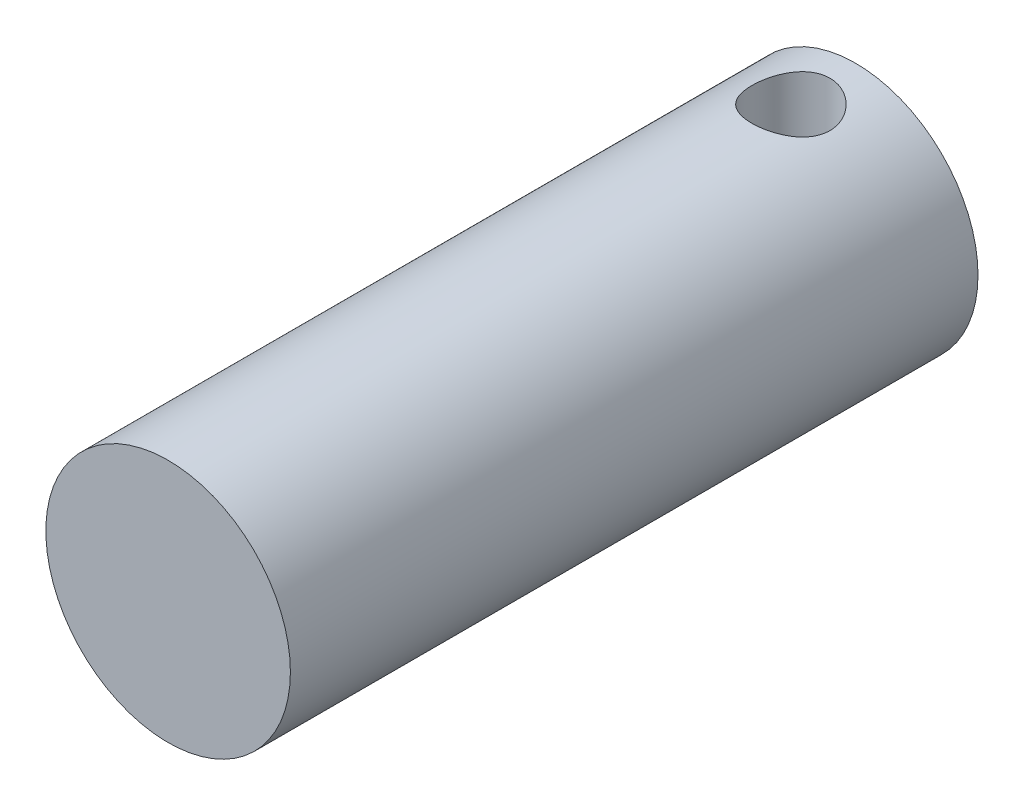
ISO-10303-21;
HEADER;
FILE_DESCRIPTION(('STEP AP214'),'2;1');
FILE_NAME('part.step','',(''),(''),'','','');
FILE_SCHEMA(('AUTOMOTIVE_DESIGN { 1 0 10303 214 1 1 1 1 }'));
ENDSEC;
DATA;
#1=APPLICATION_CONTEXT('core data for automotive mechanical design processes');
#2=APPLICATION_PROTOCOL_DEFINITION('international standard','automotive_design',2000,#1);
#3=PRODUCT_CONTEXT('',#1,'mechanical');
#4=PRODUCT('Part','Part','',(#3));
#5=PRODUCT_RELATED_PRODUCT_CATEGORY('part','',(#4));
#6=PRODUCT_DEFINITION_FORMATION('','',#4);
#7=PRODUCT_DEFINITION_CONTEXT('part definition',#1,'design');
#8=PRODUCT_DEFINITION('design','',#6,#7);
#9=PRODUCT_DEFINITION_SHAPE('','',#8);
#10=(LENGTH_UNIT() NAMED_UNIT(*) SI_UNIT(.MILLI.,.METRE.));
#11=(NAMED_UNIT(*) PLANE_ANGLE_UNIT() SI_UNIT($,.RADIAN.));
#12=(NAMED_UNIT(*) SI_UNIT($,.STERADIAN.) SOLID_ANGLE_UNIT());
#13=UNCERTAINTY_MEASURE_WITH_UNIT(LENGTH_MEASURE(1.E-05),#10,'distance_accuracy_value','');
#14=(GEOMETRIC_REPRESENTATION_CONTEXT(3) GLOBAL_UNCERTAINTY_ASSIGNED_CONTEXT((#13)) GLOBAL_UNIT_ASSIGNED_CONTEXT((#10,
#11,#12)) REPRESENTATION_CONTEXT('',''));
#15=CARTESIAN_POINT('',(0.,0.,0.));
#16=DIRECTION('',(0.,0.,1.));
#17=DIRECTION('',(1.,0.,0.));
#18=AXIS2_PLACEMENT_3D('',#15,#16,#17);
#19=CARTESIAN_POINT('',(0.,0.,11.176));
#20=DIRECTION('',(0.,0.,-1.));
#21=DIRECTION('',(-1.,0.,0.));
#22=AXIS2_PLACEMENT_3D('',#19,#20,#21);
#23=CYLINDRICAL_SURFACE('',#22,3.975);
#24=CARTESIAN_POINT('',(0.,-3.975,-7.7978));
#25=CARTESIAN_POINT('',(0.0694555135861106,-3.97499981723706,-7.79780021150494));
#26=CARTESIAN_POINT('',(0.138913587865534,-3.9731625429293,-7.80351641915072));
#27=CARTESIAN_POINT('',(0.275793631861763,-3.96601360600989,-7.82616699751157));
#28=CARTESIAN_POINT('',(0.343215221432785,-3.96070129886419,-7.8431034493164));
#29=CARTESIAN_POINT('',(0.474028872141542,-3.94718160930189,-7.88756160374667));
#30=CARTESIAN_POINT('',(0.537427150778992,-3.93897882898282,-7.9150664859913));
#31=CARTESIAN_POINT('',(0.658711562041754,-3.92052193008871,-7.97980769844029));
#32=CARTESIAN_POINT('',(0.716596749176579,-3.91026746058241,-8.01704569377967));
#33=CARTESIAN_POINT('',(0.827071776887699,-3.88842411200302,-8.10145455287238));
#34=CARTESIAN_POINT('',(0.879459754274934,-3.87680519185679,-8.14888180814311));
#35=CARTESIAN_POINT('',(0.975689833373921,-3.85371354943877,-8.25177726837262));
#36=CARTESIAN_POINT('',(1.01953025155735,-3.84224085638293,-8.30724705364533));
#37=CARTESIAN_POINT('',(1.09853417354272,-3.82041563167842,-8.42642343348404));
#38=CARTESIAN_POINT('',(1.13344214391376,-3.8101000263895,-8.49030683280763));
#39=CARTESIAN_POINT('',(1.19193439298974,-3.79221040965154,-8.62342039444846));
#40=CARTESIAN_POINT('',(1.21552180872042,-3.78463563883637,-8.69264906936247));
#41=CARTESIAN_POINT('',(1.24995859051968,-3.77340025167688,-8.83220412659465));
#42=CARTESIAN_POINT('',(1.26118369299813,-3.76962449929591,-8.90242825865729));
#43=CARTESIAN_POINT('',(1.27175133509752,-3.76607322167336,-9.04385680500838));
#44=CARTESIAN_POINT('',(1.27109719921044,-3.76629657725183,-9.11506093946208));
#45=CARTESIAN_POINT('',(1.25821809979171,-3.77061688962129,-9.25328899497791));
#46=CARTESIAN_POINT('',(1.2464748808167,-3.77455256378272,-9.32036369970257));
#47=CARTESIAN_POINT('',(1.21253362492412,-3.78559142817819,-9.45153589091347));
#48=CARTESIAN_POINT('',(1.19033443091018,-3.79269496897528,-9.51563304703062));
#49=CARTESIAN_POINT('',(1.13577944920448,-3.80938989378851,-9.64016070694961));
#50=CARTESIAN_POINT('',(1.10327522243695,-3.81901725718609,-9.70052114908531));
#51=CARTESIAN_POINT('',(1.02913591591892,-3.83965904722408,-9.81508708945022));
#52=CARTESIAN_POINT('',(0.987498375011065,-3.85067384739628,-9.86929092266872));
#53=CARTESIAN_POINT('',(0.893926969963961,-3.8734923369815,-9.97272318615309));
#54=CARTESIAN_POINT('',(0.841596654569321,-3.88530859230431,-10.0215908734226));
#55=CARTESIAN_POINT('',(0.729337116492129,-3.90793637281939,-10.1099467726385));
#56=CARTESIAN_POINT('',(0.669407279338956,-3.9187478166435,-10.1494342253895));
#57=CARTESIAN_POINT('',(0.542931731019505,-3.93827034029223,-10.2181681167326));
#58=CARTESIAN_POINT('',(0.476334307880395,-3.9469628646277,-10.2473250298816));
#59=CARTESIAN_POINT('',(0.338837003990814,-3.96113398220422,-10.293913291822));
#60=CARTESIAN_POINT('',(0.267938499161626,-3.96661359733859,-10.3113483691027));
#61=CARTESIAN_POINT('',(0.126910975779216,-3.97357545375796,-10.3333754588129));
#62=CARTESIAN_POINT('',(0.0568655723210515,-3.97520951516616,-10.3384555254583));
#63=CARTESIAN_POINT('',(-0.0830862973899316,-3.97474724410567,-10.3370091311871));
#64=CARTESIAN_POINT('',(-0.152992783315756,-3.97265148410504,-10.330484451414));
#65=CARTESIAN_POINT('',(-0.288776614883787,-3.96506498608253,-10.3064038201752));
#66=CARTESIAN_POINT('',(-0.354711534901242,-3.95966461126888,-10.2891412895017));
#67=CARTESIAN_POINT('',(-0.482728236086968,-3.94610509391899,-10.2444359060554));
#68=CARTESIAN_POINT('',(-0.54480953424443,-3.93794560638014,-10.2169917801226));
#69=CARTESIAN_POINT('',(-0.665087572526499,-3.91944909009798,-10.1519357563785));
#70=CARTESIAN_POINT('',(-0.723148056681775,-3.90906263616517,-10.1140863876726));
#71=CARTESIAN_POINT('',(-0.832255650716605,-3.88729672639886,-10.0295771841522));
#72=CARTESIAN_POINT('',(-0.883300770537755,-3.87591699029033,-9.98291485822936));
#73=CARTESIAN_POINT('',(-0.979131421598421,-3.85285073976554,-9.87980830450525));
#74=CARTESIAN_POINT('',(-1.02356888519685,-3.84117111603631,-9.82303827687436));
#75=CARTESIAN_POINT('',(-1.1023216672563,-3.81931772994651,-9.70259386628185));
#76=CARTESIAN_POINT('',(-1.13663707466082,-3.80914395435431,-9.63891954399567));
#77=CARTESIAN_POINT('',(-1.19397389487889,-3.79156341277176,-9.50655796419863));
#78=CARTESIAN_POINT('',(-1.21703292034424,-3.78414745174509,-9.43788829469908));
#79=CARTESIAN_POINT('',(-1.2511709059655,-3.77299948784869,-9.29735316104881));
#80=CARTESIAN_POINT('',(-1.26225469449446,-3.76926600027165,-9.22548899708435));
#81=CARTESIAN_POINT('',(-1.27177071025911,-3.76606514467565,-9.08425692412455));
#82=CARTESIAN_POINT('',(-1.27077609873585,-3.76640449720953,-9.01493155282351));
#83=CARTESIAN_POINT('',(-1.25755607701048,-3.77083879455352,-8.87748865944878));
#84=CARTESIAN_POINT('',(-1.24533123612704,-3.77493354898278,-8.80937107632448));
#85=CARTESIAN_POINT('',(-1.21038894908058,-3.78627922605872,-8.67735335450793));
#86=CARTESIAN_POINT('',(-1.18784260146667,-3.79347857538819,-8.61340315846514));
#87=CARTESIAN_POINT('',(-1.13303318868108,-3.81020708146366,-8.49014278883597));
#88=CARTESIAN_POINT('',(-1.10076808433566,-3.8197367270696,-8.43083359230977));
#89=CARTESIAN_POINT('',(-1.02590471651644,-3.84053512479862,-8.31592867377197));
#90=CARTESIAN_POINT('',(-0.982939822797271,-3.85185881245633,-8.26058180088371));
#91=CARTESIAN_POINT('',(-0.888533218708014,-3.87472443326336,-8.15769800301929));
#92=CARTESIAN_POINT('',(-0.837089199597697,-3.88626642509384,-8.11016321221694));
#93=CARTESIAN_POINT('',(-0.725038965276975,-3.90874858627752,-8.02259846358777));
#94=CARTESIAN_POINT('',(-0.664176836832364,-3.91965399278726,-7.98288602105057));
#95=CARTESIAN_POINT('',(-0.536293451567264,-3.93918632209716,-7.9143058192232));
#96=CARTESIAN_POINT('',(-0.469274353584629,-3.94781403945153,-7.88543427668081));
#97=CARTESIAN_POINT('',(-0.335921677905942,-3.96130625639061,-7.84116462354551));
#98=CARTESIAN_POINT('',(-0.269881090392078,-3.96639554446893,-7.82495140587574));
#99=CARTESIAN_POINT('',(-0.135894197460718,-3.97324213100402,-7.80327019890572));
#100=CARTESIAN_POINT('',(-0.0679483241126988,-3.97500017879697,-7.79779979308473));
#101=CARTESIAN_POINT('',(0.,-3.975,-7.7978));
#102=B_SPLINE_CURVE_WITH_KNOTS('',3,(#24,#25,#26,#27,#28,#29,#30,#31,#32,#33,#34,#35,#36,#37,
#38,#39,#40,#41,#42,#43,#44,#45,#46,#47,#48,#49,#50,#51,#52,#53,#54,#55,#56,#57,#58,#59,#60,#61,
#62,#63,#64,#65,#66,#67,#68,#69,#70,#71,#72,#73,#74,#75,#76,#77,#78,#79,#80,#81,#82,#83,#84,#85,
#86,#87,#88,#89,#90,#91,#92,#93,#94,#95,#96,#97,#98,#99,#100,#101),.UNSPECIFIED.,.T.,.F.,(4,2,2,
2,2,2,2,2,2,2,2,2,2,2,2,2,2,2,2,2,2,2,2,2,2,2,2,2,2,2,2,2,2,2,2,2,2,2,4),(0.,0.208116689125162,
0.416271989782381,0.624097360177628,0.831958308508242,1.04583801362305,1.25975980204955,
1.47924936553415,1.69867807135241,1.91123585646557,2.12373415664034,2.32740594245856,
2.53110027263773,2.73787331080419,2.9447021367739,3.16139846775394,3.37811233122323,
3.59666079149799,3.81513970280184,4.02483693068431,4.23450197616374,4.43867522298862,
4.64287400931485,4.85218773062387,5.06156070623689,5.27963028397,5.49769794544728,
5.71503186993345,5.93227813341341,6.13925726021942,6.34622589475717,6.54988137094009,
6.75357960758439,6.96555561259882,7.17758943117874,7.39697810332785,7.61629014200582,
7.81993649858824,8.02353704109098),.UNSPECIFIED.);
#103=CARTESIAN_POINT('',(0.,-3.975,-7.7978));
#104=VERTEX_POINT('',#103);
#105=EDGE_CURVE('E44',#104,#104,#102,.T.);
#106=ORIENTED_EDGE('',*,*,#105,.T.);
#107=EDGE_LOOP('',(#106));
#108=FACE_BOUND('',#107,.T.);
#109=CARTESIAN_POINT('',(0.,3.975,-7.7978));
#110=CARTESIAN_POINT('',(-0.0694555135861106,3.97499981723706,-7.79780021150494));
#111=CARTESIAN_POINT('',(-0.138913587865534,3.9731625429293,-7.80351641915072));
#112=CARTESIAN_POINT('',(-0.275793631861763,3.96601360600989,-7.82616699751157));
#113=CARTESIAN_POINT('',(-0.343215221432785,3.96070129886419,-7.8431034493164));
#114=CARTESIAN_POINT('',(-0.474028872141542,3.94718160930189,-7.88756160374667));
#115=CARTESIAN_POINT('',(-0.537427150778992,3.93897882898282,-7.9150664859913));
#116=CARTESIAN_POINT('',(-0.658711562041754,3.92052193008871,-7.97980769844029));
#117=CARTESIAN_POINT('',(-0.716596749176579,3.91026746058241,-8.01704569377967));
#118=CARTESIAN_POINT('',(-0.827071776887699,3.88842411200302,-8.10145455287238));
#119=CARTESIAN_POINT('',(-0.879459754274934,3.87680519185679,-8.14888180814311));
#120=CARTESIAN_POINT('',(-0.975689833373921,3.85371354943877,-8.25177726837262));
#121=CARTESIAN_POINT('',(-1.01953025155735,3.84224085638293,-8.30724705364533));
#122=CARTESIAN_POINT('',(-1.09853417354272,3.82041563167842,-8.42642343348404));
#123=CARTESIAN_POINT('',(-1.13344214391376,3.8101000263895,-8.49030683280763));
#124=CARTESIAN_POINT('',(-1.19193439298974,3.79221040965154,-8.62342039444846));
#125=CARTESIAN_POINT('',(-1.21552180872042,3.78463563883637,-8.69264906936247));
#126=CARTESIAN_POINT('',(-1.24995859051968,3.77340025167688,-8.83220412659465));
#127=CARTESIAN_POINT('',(-1.26118369299813,3.76962449929591,-8.90242825865729));
#128=CARTESIAN_POINT('',(-1.27175133509752,3.76607322167336,-9.04385680500838));
#129=CARTESIAN_POINT('',(-1.27109719921044,3.76629657725183,-9.11506093946208));
#130=CARTESIAN_POINT('',(-1.25821809979171,3.77061688962129,-9.25328899497791));
#131=CARTESIAN_POINT('',(-1.2464748808167,3.77455256378272,-9.32036369970257));
#132=CARTESIAN_POINT('',(-1.21253362492412,3.78559142817819,-9.45153589091347));
#133=CARTESIAN_POINT('',(-1.19033443091018,3.79269496897528,-9.51563304703062));
#134=CARTESIAN_POINT('',(-1.13577944920448,3.80938989378851,-9.64016070694961));
#135=CARTESIAN_POINT('',(-1.10327522243695,3.81901725718609,-9.70052114908531));
#136=CARTESIAN_POINT('',(-1.02913591591892,3.83965904722408,-9.81508708945022));
#137=CARTESIAN_POINT('',(-0.987498375011065,3.85067384739628,-9.86929092266872));
#138=CARTESIAN_POINT('',(-0.893926969963961,3.8734923369815,-9.97272318615309));
#139=CARTESIAN_POINT('',(-0.841596654569321,3.88530859230431,-10.0215908734226));
#140=CARTESIAN_POINT('',(-0.729337116492129,3.90793637281939,-10.1099467726385));
#141=CARTESIAN_POINT('',(-0.669407279338956,3.9187478166435,-10.1494342253895));
#142=CARTESIAN_POINT('',(-0.542931731019505,3.93827034029223,-10.2181681167326));
#143=CARTESIAN_POINT('',(-0.476334307880395,3.9469628646277,-10.2473250298816));
#144=CARTESIAN_POINT('',(-0.338837003990814,3.96113398220422,-10.293913291822));
#145=CARTESIAN_POINT('',(-0.267938499161626,3.96661359733859,-10.3113483691027));
#146=CARTESIAN_POINT('',(-0.126910975779216,3.97357545375796,-10.3333754588129));
#147=CARTESIAN_POINT('',(-0.0568655723210515,3.97520951516616,-10.3384555254583));
#148=CARTESIAN_POINT('',(0.0830862973899316,3.97474724410567,-10.3370091311871));
#149=CARTESIAN_POINT('',(0.152992783315756,3.97265148410504,-10.330484451414));
#150=CARTESIAN_POINT('',(0.288776614883787,3.96506498608253,-10.3064038201752));
#151=CARTESIAN_POINT('',(0.354711534901242,3.95966461126888,-10.2891412895017));
#152=CARTESIAN_POINT('',(0.482728236086968,3.94610509391899,-10.2444359060554));
#153=CARTESIAN_POINT('',(0.54480953424443,3.93794560638014,-10.2169917801226));
#154=CARTESIAN_POINT('',(0.665087572526499,3.91944909009798,-10.1519357563785));
#155=CARTESIAN_POINT('',(0.723148056681775,3.90906263616517,-10.1140863876726));
#156=CARTESIAN_POINT('',(0.832255650716605,3.88729672639886,-10.0295771841522));
#157=CARTESIAN_POINT('',(0.883300770537755,3.87591699029033,-9.98291485822936));
#158=CARTESIAN_POINT('',(0.979131421598421,3.85285073976554,-9.87980830450525));
#159=CARTESIAN_POINT('',(1.02356888519685,3.84117111603631,-9.82303827687436));
#160=CARTESIAN_POINT('',(1.1023216672563,3.81931772994651,-9.70259386628185));
#161=CARTESIAN_POINT('',(1.13663707466082,3.80914395435431,-9.63891954399567));
#162=CARTESIAN_POINT('',(1.19397389487889,3.79156341277176,-9.50655796419863));
#163=CARTESIAN_POINT('',(1.21703292034424,3.78414745174509,-9.43788829469908));
#164=CARTESIAN_POINT('',(1.2511709059655,3.77299948784869,-9.29735316104881));
#165=CARTESIAN_POINT('',(1.26225469449446,3.76926600027165,-9.22548899708435));
#166=CARTESIAN_POINT('',(1.27177071025911,3.76606514467565,-9.08425692412455));
#167=CARTESIAN_POINT('',(1.27077609873585,3.76640449720953,-9.01493155282351));
#168=CARTESIAN_POINT('',(1.25755607701048,3.77083879455352,-8.87748865944878));
#169=CARTESIAN_POINT('',(1.24533123612704,3.77493354898278,-8.80937107632448));
#170=CARTESIAN_POINT('',(1.21038894908058,3.78627922605872,-8.67735335450793));
#171=CARTESIAN_POINT('',(1.18784260146667,3.79347857538819,-8.61340315846514));
#172=CARTESIAN_POINT('',(1.13303318868108,3.81020708146366,-8.49014278883597));
#173=CARTESIAN_POINT('',(1.10076808433566,3.8197367270696,-8.43083359230977));
#174=CARTESIAN_POINT('',(1.02590471651644,3.84053512479862,-8.31592867377197));
#175=CARTESIAN_POINT('',(0.982939822797271,3.85185881245633,-8.26058180088371));
#176=CARTESIAN_POINT('',(0.888533218708014,3.87472443326336,-8.15769800301929));
#177=CARTESIAN_POINT('',(0.837089199597697,3.88626642509384,-8.11016321221694));
#178=CARTESIAN_POINT('',(0.725038965276975,3.90874858627752,-8.02259846358777));
#179=CARTESIAN_POINT('',(0.664176836832364,3.91965399278726,-7.98288602105057));
#180=CARTESIAN_POINT('',(0.536293451567264,3.93918632209716,-7.9143058192232));
#181=CARTESIAN_POINT('',(0.469274353584629,3.94781403945153,-7.88543427668081));
#182=CARTESIAN_POINT('',(0.335921677905942,3.96130625639061,-7.84116462354551));
#183=CARTESIAN_POINT('',(0.269881090392078,3.96639554446893,-7.82495140587574));
#184=CARTESIAN_POINT('',(0.135894197460718,3.97324213100402,-7.80327019890572));
#185=CARTESIAN_POINT('',(0.0679483241126988,3.97500017879697,-7.79779979308473));
#186=CARTESIAN_POINT('',(0.,3.975,-7.7978));
#187=B_SPLINE_CURVE_WITH_KNOTS('',3,(#109,#110,#111,#112,#113,#114,#115,#116,#117,#118,#119,
#120,#121,#122,#123,#124,#125,#126,#127,#128,#129,#130,#131,#132,#133,#134,#135,#136,#137,#138,
#139,#140,#141,#142,#143,#144,#145,#146,#147,#148,#149,#150,#151,#152,#153,#154,#155,#156,#157,
#158,#159,#160,#161,#162,#163,#164,#165,#166,#167,#168,#169,#170,#171,#172,#173,#174,#175,#176,
#177,#178,#179,#180,#181,#182,#183,#184,#185,#186),.UNSPECIFIED.,.T.,.F.,(4,2,2,2,2,2,2,2,2,2,2,
2,2,2,2,2,2,2,2,2,2,2,2,2,2,2,2,2,2,2,2,2,2,2,2,2,2,2,4),(0.,0.208116689125162,
0.416271989782381,0.624097360177628,0.831958308508242,1.04583801362305,1.25975980204955,
1.47924936553415,1.69867807135241,1.91123585646557,2.12373415664034,2.32740594245856,
2.53110027263773,2.73787331080419,2.9447021367739,3.16139846775394,3.37811233122323,
3.59666079149799,3.81513970280184,4.02483693068431,4.23450197616374,4.43867522298862,
4.64287400931485,4.85218773062387,5.06156070623689,5.27963028397,5.49769794544728,
5.71503186993345,5.93227813341341,6.13925726021942,6.34622589475717,6.54988137094009,
6.75357960758439,6.96555561259882,7.17758943117874,7.39697810332785,7.61629014200582,
7.81993649858824,8.02353704109098),.UNSPECIFIED.);
#188=CARTESIAN_POINT('',(0.,3.975,-7.7978));
#189=VERTEX_POINT('',#188);
#190=EDGE_CURVE('E58',#189,#189,#187,.T.);
#191=ORIENTED_EDGE('',*,*,#190,.T.);
#192=EDGE_LOOP('',(#191));
#193=FACE_BOUND('',#192,.T.);
#194=CARTESIAN_POINT('',(0.,0.,11.176));
#195=DIRECTION('',(0.,0.,1.));
#196=DIRECTION('',(1.,0.,0.));
#197=AXIS2_PLACEMENT_3D('',#194,#195,#196);
#198=CIRCLE('',#197,3.975);
#199=CARTESIAN_POINT('',(3.975,0.,11.176));
#200=VERTEX_POINT('',#199);
#201=EDGE_CURVE('E10',#200,#200,#198,.T.);
#202=ORIENTED_EDGE('',*,*,#201,.F.);
#203=EDGE_LOOP('',(#202));
#204=FACE_BOUND('',#203,.T.);
#205=CARTESIAN_POINT('',(0.,0.,-11.176));
#206=DIRECTION('',(0.,0.,1.));
#207=DIRECTION('',(1.,0.,0.));
#208=AXIS2_PLACEMENT_3D('',#205,#206,#207);
#209=CIRCLE('',#208,3.975);
#210=CARTESIAN_POINT('',(3.975,0.,-11.176));
#211=VERTEX_POINT('',#210);
#212=EDGE_CURVE('E52',#211,#211,#209,.T.);
#213=ORIENTED_EDGE('',*,*,#212,.T.);
#214=EDGE_LOOP('',(#213));
#215=FACE_BOUND('',#214,.T.);
#216=ADVANCED_FACE('F40',(#108,#193,#204,#215),#23,.T.);
#217=CARTESIAN_POINT('',(0.,0.,11.176));
#218=DIRECTION('',(0.,0.,1.));
#219=DIRECTION('',(1.,0.,0.));
#220=AXIS2_PLACEMENT_3D('',#217,#218,#219);
#221=PLANE('',#220);
#222=ORIENTED_EDGE('',*,*,#201,.T.);
#223=EDGE_LOOP('',(#222));
#224=FACE_BOUND('',#223,.T.);
#225=ADVANCED_FACE('F69',(#224),#221,.T.);
#226=CARTESIAN_POINT('',(0.,0.,-11.176));
#227=DIRECTION('',(0.,0.,1.));
#228=DIRECTION('',(1.,0.,0.));
#229=AXIS2_PLACEMENT_3D('',#226,#227,#228);
#230=PLANE('',#229);
#231=ORIENTED_EDGE('',*,*,#212,.F.);
#232=EDGE_LOOP('',(#231));
#233=FACE_BOUND('',#232,.T.);
#234=ADVANCED_FACE('F67',(#233),#230,.F.);
#235=CARTESIAN_POINT('',(0.,-6.35,-9.0678));
#236=DIRECTION('',(0.,1.,0.));
#237=DIRECTION('',(0.,0.,1.));
#238=AXIS2_PLACEMENT_3D('',#235,#236,#237);
#239=CYLINDRICAL_SURFACE('',#238,1.27);
#240=ORIENTED_EDGE('',*,*,#190,.F.);
#241=EDGE_LOOP('',(#240));
#242=FACE_BOUND('',#241,.T.);
#243=ORIENTED_EDGE('',*,*,#105,.F.);
#244=EDGE_LOOP('',(#243));
#245=FACE_BOUND('',#244,.T.);
#246=ADVANCED_FACE('F63',(#242,#245),#239,.F.);
#247=CLOSED_SHELL('',(#216,#225,#234,#246));
#248=MANIFOLD_SOLID_BREP('B2',#247);
#249=ADVANCED_BREP_SHAPE_REPRESENTATION('',(#18,#248),#14);
#250=SHAPE_DEFINITION_REPRESENTATION(#9,#249);
ENDSEC;
END-ISO-10303-21;
